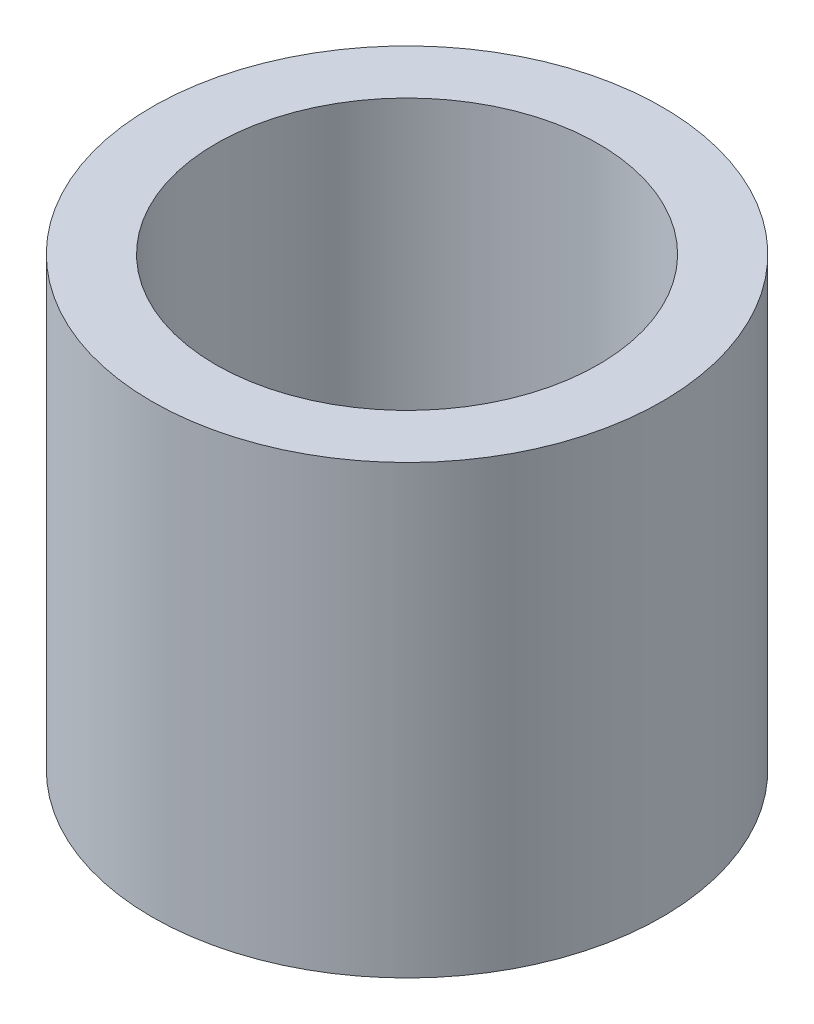
ISO-10303-21;
HEADER;
FILE_DESCRIPTION(('STEP AP214'),'2;1');
FILE_NAME('part.step','',(''),(''),'','','');
FILE_SCHEMA(('AUTOMOTIVE_DESIGN { 1 0 10303 214 1 1 1 1 }'));
ENDSEC;
DATA;
#1=APPLICATION_CONTEXT('core data for automotive mechanical design processes');
#2=APPLICATION_PROTOCOL_DEFINITION('international standard','automotive_design',2000,#1);
#3=PRODUCT_CONTEXT('',#1,'mechanical');
#4=PRODUCT('Part','Part','',(#3));
#5=PRODUCT_RELATED_PRODUCT_CATEGORY('part','',(#4));
#6=PRODUCT_DEFINITION_FORMATION('','',#4);
#7=PRODUCT_DEFINITION_CONTEXT('part definition',#1,'design');
#8=PRODUCT_DEFINITION('design','',#6,#7);
#9=PRODUCT_DEFINITION_SHAPE('','',#8);
#10=(LENGTH_UNIT() NAMED_UNIT(*) SI_UNIT(.MILLI.,.METRE.));
#11=(NAMED_UNIT(*) PLANE_ANGLE_UNIT() SI_UNIT($,.RADIAN.));
#12=(NAMED_UNIT(*) SI_UNIT($,.STERADIAN.) SOLID_ANGLE_UNIT());
#13=UNCERTAINTY_MEASURE_WITH_UNIT(LENGTH_MEASURE(1.E-05),#10,'distance_accuracy_value','');
#14=(GEOMETRIC_REPRESENTATION_CONTEXT(3) GLOBAL_UNCERTAINTY_ASSIGNED_CONTEXT((#13)) GLOBAL_UNIT_ASSIGNED_CONTEXT((#10,
#11,#12)) REPRESENTATION_CONTEXT('',''));
#15=CARTESIAN_POINT('',(0.,0.,0.));
#16=DIRECTION('',(0.,0.,1.));
#17=DIRECTION('',(1.,0.,0.));
#18=AXIS2_PLACEMENT_3D('',#15,#16,#17);
#19=CARTESIAN_POINT('',(0.,7.,0.));
#20=DIRECTION('',(0.,1.,0.));
#21=DIRECTION('',(0.,0.,1.));
#22=AXIS2_PLACEMENT_3D('',#19,#20,#21);
#23=PLANE('',#22);
#24=CARTESIAN_POINT('',(0.,7.,0.));
#25=DIRECTION('',(0.,1.,0.));
#26=DIRECTION('',(0.,0.,1.));
#27=AXIS2_PLACEMENT_3D('',#24,#25,#26);
#28=CIRCLE('',#27,4.);
#29=CARTESIAN_POINT('',(0.,7.,4.));
#30=VERTEX_POINT('',#29);
#31=EDGE_CURVE('E10',#30,#30,#28,.T.);
#32=ORIENTED_EDGE('',*,*,#31,.T.);
#33=EDGE_LOOP('',(#32));
#34=FACE_BOUND('',#33,.T.);
#35=CARTESIAN_POINT('',(0.,7.,0.));
#36=DIRECTION('',(0.,1.,0.));
#37=DIRECTION('',(0.,0.,1.));
#38=AXIS2_PLACEMENT_3D('',#35,#36,#37);
#39=CIRCLE('',#38,3.);
#40=CARTESIAN_POINT('',(0.,7.,3.));
#41=VERTEX_POINT('',#40);
#42=EDGE_CURVE('E44',#41,#41,#39,.T.);
#43=ORIENTED_EDGE('',*,*,#42,.F.);
#44=EDGE_LOOP('',(#43));
#45=FACE_BOUND('',#44,.T.);
#46=ADVANCED_FACE('F33',(#34,#45),#23,.T.);
#47=CARTESIAN_POINT('',(0.,0.,0.));
#48=DIRECTION('',(0.,1.,0.));
#49=DIRECTION('',(0.,0.,1.));
#50=AXIS2_PLACEMENT_3D('',#47,#48,#49);
#51=PLANE('',#50);
#52=CARTESIAN_POINT('',(0.,0.,0.));
#53=DIRECTION('',(0.,1.,0.));
#54=DIRECTION('',(0.,0.,1.));
#55=AXIS2_PLACEMENT_3D('',#52,#53,#54);
#56=CIRCLE('',#55,4.);
#57=CARTESIAN_POINT('',(0.,0.,4.));
#58=VERTEX_POINT('',#57);
#59=EDGE_CURVE('E37',#58,#58,#56,.T.);
#60=ORIENTED_EDGE('',*,*,#59,.F.);
#61=EDGE_LOOP('',(#60));
#62=FACE_BOUND('',#61,.T.);
#63=CARTESIAN_POINT('',(0.,0.,0.));
#64=DIRECTION('',(0.,1.,0.));
#65=DIRECTION('',(0.,0.,1.));
#66=AXIS2_PLACEMENT_3D('',#63,#64,#65);
#67=CIRCLE('',#66,3.);
#68=CARTESIAN_POINT('',(0.,0.,3.));
#69=VERTEX_POINT('',#68);
#70=EDGE_CURVE('E46',#69,#69,#67,.T.);
#71=ORIENTED_EDGE('',*,*,#70,.T.);
#72=EDGE_LOOP('',(#71));
#73=FACE_BOUND('',#72,.T.);
#74=ADVANCED_FACE('F56',(#62,#73),#51,.F.);
#75=CARTESIAN_POINT('',(0.,7.,0.));
#76=DIRECTION('',(0.,-1.,0.));
#77=DIRECTION('',(0.,0.,-1.));
#78=AXIS2_PLACEMENT_3D('',#75,#76,#77);
#79=CYLINDRICAL_SURFACE('',#78,4.);
#80=ORIENTED_EDGE('',*,*,#31,.F.);
#81=EDGE_LOOP('',(#80));
#82=FACE_BOUND('',#81,.T.);
#83=ORIENTED_EDGE('',*,*,#59,.T.);
#84=EDGE_LOOP('',(#83));
#85=FACE_BOUND('',#84,.T.);
#86=ADVANCED_FACE('F35',(#82,#85),#79,.T.);
#87=CARTESIAN_POINT('',(0.,7.,0.));
#88=DIRECTION('',(0.,-1.,0.));
#89=DIRECTION('',(0.,0.,-1.));
#90=AXIS2_PLACEMENT_3D('',#87,#88,#89);
#91=CYLINDRICAL_SURFACE('',#90,3.);
#92=ORIENTED_EDGE('',*,*,#42,.T.);
#93=EDGE_LOOP('',(#92));
#94=FACE_BOUND('',#93,.T.);
#95=ORIENTED_EDGE('',*,*,#70,.F.);
#96=EDGE_LOOP('',(#95));
#97=FACE_BOUND('',#96,.T.);
#98=ADVANCED_FACE('F52',(#94,#97),#91,.F.);
#99=CLOSED_SHELL('',(#46,#74,#86,#98));
#100=MANIFOLD_SOLID_BREP('B2',#99);
#101=ADVANCED_BREP_SHAPE_REPRESENTATION('',(#18,#100),#14);
#102=SHAPE_DEFINITION_REPRESENTATION(#9,#101);
ENDSEC;
END-ISO-10303-21;
